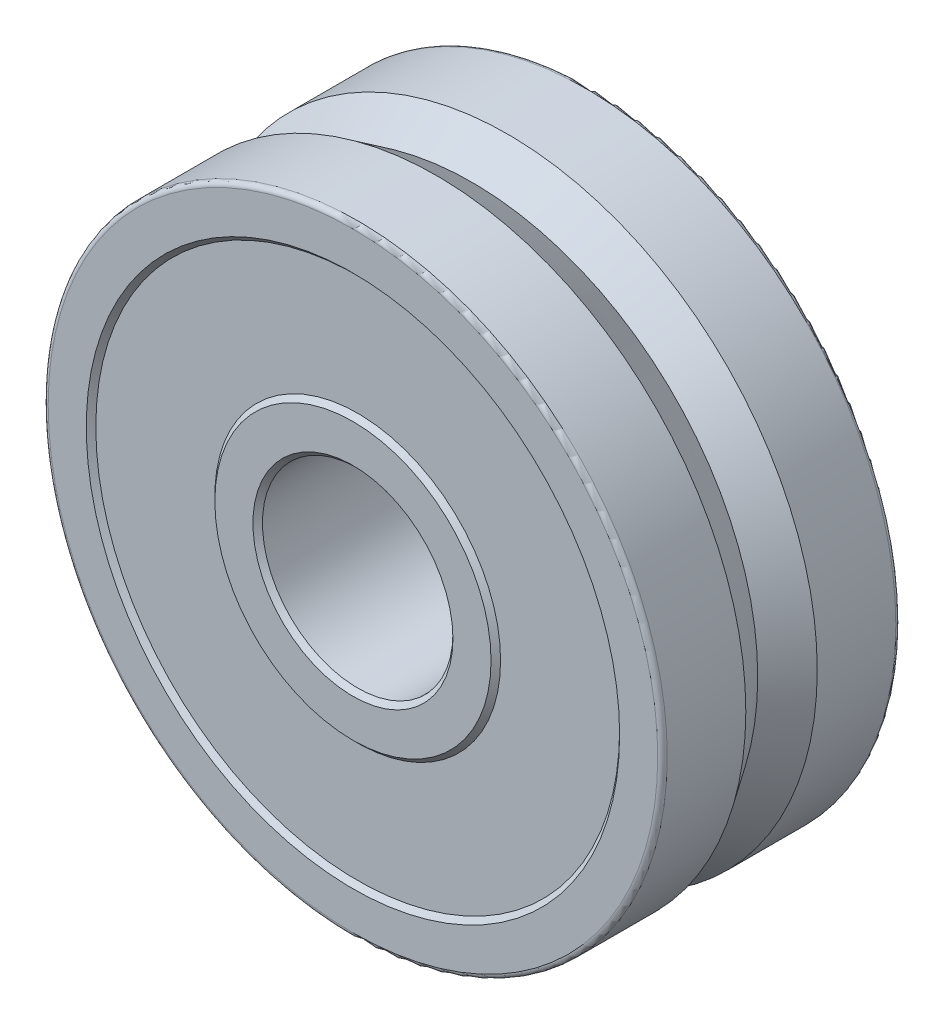
ISO-10303-21;
HEADER;
FILE_DESCRIPTION(('STEP AP214'),'2;1');
FILE_NAME('part.step','',(''),(''),'','','');
FILE_SCHEMA(('AUTOMOTIVE_DESIGN { 1 0 10303 214 1 1 1 1 }'));
ENDSEC;
DATA;
#1=APPLICATION_CONTEXT('core data for automotive mechanical design processes');
#2=APPLICATION_PROTOCOL_DEFINITION('international standard','automotive_design',2000,#1);
#3=PRODUCT_CONTEXT('',#1,'mechanical');
#4=PRODUCT('Part','Part','',(#3));
#5=PRODUCT_RELATED_PRODUCT_CATEGORY('part','',(#4));
#6=PRODUCT_DEFINITION_FORMATION('','',#4);
#7=PRODUCT_DEFINITION_CONTEXT('part definition',#1,'design');
#8=PRODUCT_DEFINITION('design','',#6,#7);
#9=PRODUCT_DEFINITION_SHAPE('','',#8);
#10=(LENGTH_UNIT() NAMED_UNIT(*) SI_UNIT(.MILLI.,.METRE.));
#11=(NAMED_UNIT(*) PLANE_ANGLE_UNIT() SI_UNIT($,.RADIAN.));
#12=(NAMED_UNIT(*) SI_UNIT($,.STERADIAN.) SOLID_ANGLE_UNIT());
#13=UNCERTAINTY_MEASURE_WITH_UNIT(LENGTH_MEASURE(1.E-05),#10,'distance_accuracy_value','');
#14=(GEOMETRIC_REPRESENTATION_CONTEXT(3) GLOBAL_UNCERTAINTY_ASSIGNED_CONTEXT((#13)) GLOBAL_UNIT_ASSIGNED_CONTEXT((#10,
#11,#12)) REPRESENTATION_CONTEXT('',''));
#15=CARTESIAN_POINT('',(0.,0.,0.));
#16=DIRECTION('',(0.,0.,1.));
#17=DIRECTION('',(1.,0.,0.));
#18=AXIS2_PLACEMENT_3D('',#15,#16,#17);
#19=CARTESIAN_POINT('',(0.,0.,2.5));
#20=DIRECTION('',(0.,0.,-1.));
#21=DIRECTION('',(-1.,0.,0.));
#22=AXIS2_PLACEMENT_3D('',#19,#20,#21);
#23=CYLINDRICAL_SURFACE('',#22,6.5);
#24=CARTESIAN_POINT('',(0.,0.,-2.4));
#25=DIRECTION('',(0.,0.,1.));
#26=DIRECTION('',(1.,0.,0.));
#27=AXIS2_PLACEMENT_3D('',#24,#25,#26);
#28=CIRCLE('',#27,6.5);
#29=CARTESIAN_POINT('',(6.5,0.,-2.4));
#30=VERTEX_POINT('',#29);
#31=EDGE_CURVE('E52',#30,#30,#28,.T.);
#32=ORIENTED_EDGE('',*,*,#31,.T.);
#33=EDGE_LOOP('',(#32));
#34=FACE_BOUND('',#33,.T.);
#35=CARTESIAN_POINT('',(0.,0.,-0.75));
#36=DIRECTION('',(0.,0.,1.));
#37=DIRECTION('',(1.,0.,0.));
#38=AXIS2_PLACEMENT_3D('',#35,#36,#37);
#39=CIRCLE('',#38,6.5);
#40=CARTESIAN_POINT('',(6.5,0.,-0.75));
#41=VERTEX_POINT('',#40);
#42=EDGE_CURVE('E75',#41,#41,#39,.T.);
#43=ORIENTED_EDGE('',*,*,#42,.F.);
#44=EDGE_LOOP('',(#43));
#45=FACE_BOUND('',#44,.T.);
#46=ADVANCED_FACE('F15',(#34,#45),#23,.T.);
#47=CARTESIAN_POINT('',(0.,0.,2.4));
#48=DIRECTION('',(0.,0.,1.));
#49=DIRECTION('',(1.,0.,0.));
#50=AXIS2_PLACEMENT_3D('',#47,#48,#49);
#51=CIRCLE('',#50,6.5);
#52=CARTESIAN_POINT('',(6.5,0.,2.4));
#53=VERTEX_POINT('',#52);
#54=EDGE_CURVE('E57',#53,#53,#51,.F.);
#55=ORIENTED_EDGE('',*,*,#54,.T.);
#56=EDGE_LOOP('',(#55));
#57=FACE_BOUND('',#56,.T.);
#58=CARTESIAN_POINT('',(0.,0.,0.75));
#59=DIRECTION('',(0.,0.,1.));
#60=DIRECTION('',(1.,0.,0.));
#61=AXIS2_PLACEMENT_3D('',#58,#59,#60);
#62=CIRCLE('',#61,6.5);
#63=CARTESIAN_POINT('',(6.5,0.,0.75));
#64=VERTEX_POINT('',#63);
#65=EDGE_CURVE('E80',#64,#64,#62,.T.);
#66=ORIENTED_EDGE('',*,*,#65,.T.);
#67=EDGE_LOOP('',(#66));
#68=FACE_BOUND('',#67,.T.);
#69=ADVANCED_FACE('F82',(#57,#68),#23,.T.);
#70=CARTESIAN_POINT('',(0.,0.,-2.5));
#71=DIRECTION('',(0.,0.,1.));
#72=DIRECTION('',(1.,0.,0.));
#73=AXIS2_PLACEMENT_3D('',#70,#71,#72);
#74=PLANE('',#73);
#75=CARTESIAN_POINT('',(0.,0.,-2.5));
#76=DIRECTION('',(0.,0.,1.));
#77=DIRECTION('',(1.,0.,0.));
#78=AXIS2_PLACEMENT_3D('',#75,#76,#77);
#79=CIRCLE('',#78,2.9);
#80=CARTESIAN_POINT('',(2.9,0.,-2.5));
#81=VERTEX_POINT('',#80);
#82=EDGE_CURVE('E22',#81,#81,#79,.F.);
#83=ORIENTED_EDGE('',*,*,#82,.T.);
#84=EDGE_LOOP('',(#83));
#85=FACE_BOUND('',#84,.T.);
#86=CARTESIAN_POINT('',(0.,0.,-2.5));
#87=DIRECTION('',(0.,0.,1.));
#88=DIRECTION('',(1.,0.,0.));
#89=AXIS2_PLACEMENT_3D('',#86,#87,#88);
#90=CIRCLE('',#89,2.1);
#91=CARTESIAN_POINT('',(2.1,0.,-2.5));
#92=VERTEX_POINT('',#91);
#93=EDGE_CURVE('E42',#92,#92,#90,.T.);
#94=ORIENTED_EDGE('',*,*,#93,.T.);
#95=EDGE_LOOP('',(#94));
#96=FACE_BOUND('',#95,.T.);
#97=ADVANCED_FACE('F105',(#85,#96),#74,.F.);
#98=CARTESIAN_POINT('',(0.,0.,2.5));
#99=DIRECTION('',(0.,0.,1.));
#100=DIRECTION('',(1.,0.,0.));
#101=AXIS2_PLACEMENT_3D('',#98,#99,#100);
#102=PLANE('',#101);
#103=CARTESIAN_POINT('',(0.,0.,2.5));
#104=DIRECTION('',(0.,0.,1.));
#105=DIRECTION('',(1.,0.,0.));
#106=AXIS2_PLACEMENT_3D('',#103,#104,#105);
#107=CIRCLE('',#106,2.9);
#108=CARTESIAN_POINT('',(2.9,0.,2.5));
#109=VERTEX_POINT('',#108);
#110=EDGE_CURVE('E27',#109,#109,#107,.T.);
#111=ORIENTED_EDGE('',*,*,#110,.T.);
#112=EDGE_LOOP('',(#111));
#113=FACE_BOUND('',#112,.T.);
#114=CARTESIAN_POINT('',(0.,0.,2.5));
#115=DIRECTION('',(0.,0.,1.));
#116=DIRECTION('',(1.,0.,0.));
#117=AXIS2_PLACEMENT_3D('',#114,#115,#116);
#118=CIRCLE('',#117,2.1);
#119=CARTESIAN_POINT('',(2.1,0.,2.5));
#120=VERTEX_POINT('',#119);
#121=EDGE_CURVE('E34',#120,#120,#118,.F.);
#122=ORIENTED_EDGE('',*,*,#121,.T.);
#123=EDGE_LOOP('',(#122));
#124=FACE_BOUND('',#123,.T.);
#125=ADVANCED_FACE('F161',(#113,#124),#102,.T.);
#126=CARTESIAN_POINT('',(0.,0.,2.5));
#127=DIRECTION('',(0.,0.,1.));
#128=DIRECTION('',(1.,0.,0.));
#129=AXIS2_PLACEMENT_3D('',#126,#127,#128);
#130=CIRCLE('',#129,5.6);
#131=CARTESIAN_POINT('',(5.6,0.,2.5));
#132=VERTEX_POINT('',#131);
#133=EDGE_CURVE('E28',#132,#132,#130,.F.);
#134=ORIENTED_EDGE('',*,*,#133,.T.);
#135=EDGE_LOOP('',(#134));
#136=FACE_BOUND('',#135,.T.);
#137=CARTESIAN_POINT('',(0.,0.,2.5));
#138=DIRECTION('',(0.,0.,1.));
#139=DIRECTION('',(1.,0.,0.));
#140=AXIS2_PLACEMENT_3D('',#137,#138,#139);
#141=CIRCLE('',#140,6.4);
#142=CARTESIAN_POINT('',(6.4,0.,2.5));
#143=VERTEX_POINT('',#142);
#144=EDGE_CURVE('E50',#143,#143,#141,.T.);
#145=ORIENTED_EDGE('',*,*,#144,.T.);
#146=EDGE_LOOP('',(#145));
#147=FACE_BOUND('',#146,.T.);
#148=ADVANCED_FACE('F157',(#136,#147),#102,.T.);
#149=CARTESIAN_POINT('',(0.,0.,-2.5));
#150=DIRECTION('',(0.,0.,1.));
#151=DIRECTION('',(1.,0.,0.));
#152=AXIS2_PLACEMENT_3D('',#149,#150,#151);
#153=CIRCLE('',#152,5.6);
#154=CARTESIAN_POINT('',(5.6,0.,-2.5));
#155=VERTEX_POINT('',#154);
#156=EDGE_CURVE('E10',#155,#155,#153,.T.);
#157=ORIENTED_EDGE('',*,*,#156,.T.);
#158=EDGE_LOOP('',(#157));
#159=FACE_BOUND('',#158,.T.);
#160=CARTESIAN_POINT('',(0.,0.,-2.5));
#161=DIRECTION('',(0.,0.,1.));
#162=DIRECTION('',(1.,0.,0.));
#163=AXIS2_PLACEMENT_3D('',#160,#161,#162);
#164=CIRCLE('',#163,6.4);
#165=CARTESIAN_POINT('',(6.4,0.,-2.5));
#166=VERTEX_POINT('',#165);
#167=EDGE_CURVE('E49',#166,#166,#164,.F.);
#168=ORIENTED_EDGE('',*,*,#167,.T.);
#169=EDGE_LOOP('',(#168));
#170=FACE_BOUND('',#169,.T.);
#171=ADVANCED_FACE('F110',(#159,#170),#74,.F.);
#172=CARTESIAN_POINT('',(0.,0.,2.5));
#173=DIRECTION('',(0.,0.,-1.));
#174=DIRECTION('',(-1.,0.,0.));
#175=AXIS2_PLACEMENT_3D('',#172,#173,#174);
#176=CYLINDRICAL_SURFACE('',#175,2.);
#177=CARTESIAN_POINT('',(0.,0.,-2.4));
#178=DIRECTION('',(0.,0.,1.));
#179=DIRECTION('',(1.,0.,0.));
#180=AXIS2_PLACEMENT_3D('',#177,#178,#179);
#181=CIRCLE('',#180,2.);
#182=CARTESIAN_POINT('',(2.,0.,-2.4));
#183=VERTEX_POINT('',#182);
#184=EDGE_CURVE('E36',#183,#183,#181,.F.);
#185=ORIENTED_EDGE('',*,*,#184,.T.);
#186=EDGE_LOOP('',(#185));
#187=FACE_BOUND('',#186,.T.);
#188=CARTESIAN_POINT('',(0.,0.,2.4));
#189=DIRECTION('',(0.,0.,1.));
#190=DIRECTION('',(1.,0.,0.));
#191=AXIS2_PLACEMENT_3D('',#188,#189,#190);
#192=CIRCLE('',#191,2.);
#193=CARTESIAN_POINT('',(2.,0.,2.4));
#194=VERTEX_POINT('',#193);
#195=EDGE_CURVE('E41',#194,#194,#192,.T.);
#196=ORIENTED_EDGE('',*,*,#195,.T.);
#197=EDGE_LOOP('',(#196));
#198=FACE_BOUND('',#197,.T.);
#199=ADVANCED_FACE('F155',(#187,#198),#176,.F.);
#200=CARTESIAN_POINT('',(0.,0.,2.4));
#201=DIRECTION('',(0.,0.,1.));
#202=DIRECTION('',(1.,0.,0.));
#203=AXIS2_PLACEMENT_3D('',#200,#201,#202);
#204=PLANE('',#203);
#205=CARTESIAN_POINT('',(0.,0.,2.4));
#206=DIRECTION('',(0.,0.,1.));
#207=DIRECTION('',(1.,0.,0.));
#208=AXIS2_PLACEMENT_3D('',#205,#206,#207);
#209=CIRCLE('',#208,3.);
#210=CARTESIAN_POINT('',(3.,0.,2.4));
#211=VERTEX_POINT('',#210);
#212=EDGE_CURVE('E62',#211,#211,#209,.T.);
#213=ORIENTED_EDGE('',*,*,#212,.F.);
#214=EDGE_LOOP('',(#213));
#215=FACE_BOUND('',#214,.T.);
#216=CARTESIAN_POINT('',(0.,0.,2.4));
#217=DIRECTION('',(0.,0.,1.));
#218=DIRECTION('',(1.,0.,0.));
#219=AXIS2_PLACEMENT_3D('',#216,#217,#218);
#220=CIRCLE('',#219,5.5);
#221=CARTESIAN_POINT('',(5.5,0.,2.4));
#222=VERTEX_POINT('',#221);
#223=EDGE_CURVE('E56',#222,#222,#220,.T.);
#224=ORIENTED_EDGE('',*,*,#223,.T.);
#225=EDGE_LOOP('',(#224));
#226=FACE_BOUND('',#225,.T.);
#227=ADVANCED_FACE('F144',(#215,#226),#204,.T.);
#228=CARTESIAN_POINT('',(0.,0.,-2.4));
#229=DIRECTION('',(0.,0.,-1.));
#230=DIRECTION('',(1.,0.,0.));
#231=AXIS2_PLACEMENT_3D('',#228,#229,#230);
#232=PLANE('',#231);
#233=CARTESIAN_POINT('',(0.,0.,-2.4));
#234=DIRECTION('',(0.,0.,1.));
#235=DIRECTION('',(1.,0.,0.));
#236=AXIS2_PLACEMENT_3D('',#233,#234,#235);
#237=CIRCLE('',#236,5.5);
#238=CARTESIAN_POINT('',(5.5,0.,-2.4));
#239=VERTEX_POINT('',#238);
#240=EDGE_CURVE('E65',#239,#239,#237,.T.);
#241=ORIENTED_EDGE('',*,*,#240,.F.);
#242=EDGE_LOOP('',(#241));
#243=FACE_BOUND('',#242,.T.);
#244=CARTESIAN_POINT('',(0.,0.,-2.4));
#245=DIRECTION('',(0.,0.,1.));
#246=DIRECTION('',(1.,0.,0.));
#247=AXIS2_PLACEMENT_3D('',#244,#245,#246);
#248=CIRCLE('',#247,3.);
#249=CARTESIAN_POINT('',(3.,0.,-2.4));
#250=VERTEX_POINT('',#249);
#251=EDGE_CURVE('E70',#250,#250,#248,.T.);
#252=ORIENTED_EDGE('',*,*,#251,.T.);
#253=EDGE_LOOP('',(#252));
#254=FACE_BOUND('',#253,.T.);
#255=ADVANCED_FACE('F114',(#243,#254),#232,.T.);
#256=CARTESIAN_POINT('',(0.,0.,-2.4));
#257=DIRECTION('',(0.,0.,1.));
#258=DIRECTION('',(1.,0.,0.));
#259=AXIS2_PLACEMENT_3D('',#256,#257,#258);
#260=TOROIDAL_SURFACE('',#259,6.4,0.1);
#261=ORIENTED_EDGE('',*,*,#167,.F.);
#262=EDGE_LOOP('',(#261));
#263=FACE_BOUND('',#262,.T.);
#264=ORIENTED_EDGE('',*,*,#31,.F.);
#265=EDGE_LOOP('',(#264));
#266=FACE_BOUND('',#265,.T.);
#267=ADVANCED_FACE('F108',(#263,#266),#260,.T.);
#268=CARTESIAN_POINT('',(0.,0.,2.4));
#269=DIRECTION('',(0.,0.,1.));
#270=DIRECTION('',(1.,0.,0.));
#271=AXIS2_PLACEMENT_3D('',#268,#269,#270);
#272=TOROIDAL_SURFACE('',#271,6.4,0.1);
#273=ORIENTED_EDGE('',*,*,#54,.F.);
#274=EDGE_LOOP('',(#273));
#275=FACE_BOUND('',#274,.T.);
#276=ORIENTED_EDGE('',*,*,#144,.F.);
#277=EDGE_LOOP('',(#276));
#278=FACE_BOUND('',#277,.T.);
#279=ADVANCED_FACE('F115',(#275,#278),#272,.T.);
#280=CARTESIAN_POINT('',(0.,0.,-2.5));
#281=DIRECTION('',(0.,0.,-1.));
#282=DIRECTION('',(-1.,0.,0.));
#283=AXIS2_PLACEMENT_3D('',#280,#281,#282);
#284=CONICAL_SURFACE('',#283,2.1,0.785398163397439);
#285=ORIENTED_EDGE('',*,*,#184,.F.);
#286=EDGE_LOOP('',(#285));
#287=FACE_BOUND('',#286,.T.);
#288=ORIENTED_EDGE('',*,*,#93,.F.);
#289=EDGE_LOOP('',(#288));
#290=FACE_BOUND('',#289,.T.);
#291=ADVANCED_FACE('F117',(#287,#290),#284,.F.);
#292=CARTESIAN_POINT('',(0.,0.,2.4));
#293=DIRECTION('',(0.,0.,1.));
#294=DIRECTION('',(1.,0.,0.));
#295=AXIS2_PLACEMENT_3D('',#292,#293,#294);
#296=CONICAL_SURFACE('',#295,2.,0.785398163397455);
#297=ORIENTED_EDGE('',*,*,#121,.F.);
#298=EDGE_LOOP('',(#297));
#299=FACE_BOUND('',#298,.T.);
#300=ORIENTED_EDGE('',*,*,#195,.F.);
#301=EDGE_LOOP('',(#300));
#302=FACE_BOUND('',#301,.T.);
#303=ADVANCED_FACE('F124',(#299,#302),#296,.F.);
#304=CARTESIAN_POINT('',(0.,0.,2.4));
#305=DIRECTION('',(0.,0.,1.));
#306=DIRECTION('',(1.,0.,0.));
#307=AXIS2_PLACEMENT_3D('',#304,#305,#306);
#308=CONICAL_SURFACE('',#307,5.5,0.785398163397448);
#309=ORIENTED_EDGE('',*,*,#133,.F.);
#310=EDGE_LOOP('',(#309));
#311=FACE_BOUND('',#310,.T.);
#312=ORIENTED_EDGE('',*,*,#223,.F.);
#313=EDGE_LOOP('',(#312));
#314=FACE_BOUND('',#313,.T.);
#315=ADVANCED_FACE('F122',(#311,#314),#308,.F.);
#316=CARTESIAN_POINT('',(0.,0.,2.5));
#317=DIRECTION('',(0.,0.,-1.));
#318=DIRECTION('',(-1.,0.,0.));
#319=AXIS2_PLACEMENT_3D('',#316,#317,#318);
#320=CONICAL_SURFACE('',#319,2.9,0.785398163397444);
#321=ORIENTED_EDGE('',*,*,#212,.T.);
#322=EDGE_LOOP('',(#321));
#323=FACE_BOUND('',#322,.T.);
#324=ORIENTED_EDGE('',*,*,#110,.F.);
#325=EDGE_LOOP('',(#324));
#326=FACE_BOUND('',#325,.T.);
#327=ADVANCED_FACE('F127',(#323,#326),#320,.T.);
#328=CARTESIAN_POINT('',(0.,0.,-2.4));
#329=DIRECTION('',(0.,0.,1.));
#330=DIRECTION('',(1.,0.,0.));
#331=AXIS2_PLACEMENT_3D('',#328,#329,#330);
#332=CONICAL_SURFACE('',#331,3.,0.785398163397444);
#333=ORIENTED_EDGE('',*,*,#82,.F.);
#334=EDGE_LOOP('',(#333));
#335=FACE_BOUND('',#334,.T.);
#336=ORIENTED_EDGE('',*,*,#251,.F.);
#337=EDGE_LOOP('',(#336));
#338=FACE_BOUND('',#337,.T.);
#339=ADVANCED_FACE('F135',(#335,#338),#332,.T.);
#340=CARTESIAN_POINT('',(0.,0.,-2.5));
#341=DIRECTION('',(0.,0.,-1.));
#342=DIRECTION('',(-1.,0.,0.));
#343=AXIS2_PLACEMENT_3D('',#340,#341,#342);
#344=CONICAL_SURFACE('',#343,5.6,0.785398163397448);
#345=ORIENTED_EDGE('',*,*,#240,.T.);
#346=EDGE_LOOP('',(#345));
#347=FACE_BOUND('',#346,.T.);
#348=ORIENTED_EDGE('',*,*,#156,.F.);
#349=EDGE_LOOP('',(#348));
#350=FACE_BOUND('',#349,.T.);
#351=ADVANCED_FACE('F17',(#347,#350),#344,.F.);
#352=CARTESIAN_POINT('',(0.,0.,0.));
#353=DIRECTION('',(0.,0.,-1.));
#354=DIRECTION('',(-1.,0.,0.));
#355=AXIS2_PLACEMENT_3D('',#352,#353,#354);
#356=CONICAL_SURFACE('',#355,6.,0.588002603547567);
#357=ORIENTED_EDGE('',*,*,#42,.T.);
#358=EDGE_LOOP('',(#357));
#359=FACE_BOUND('',#358,.T.);
#360=CARTESIAN_POINT('',(0.,0.,0.));
#361=DIRECTION('',(0.,0.,1.));
#362=DIRECTION('',(1.,0.,0.));
#363=AXIS2_PLACEMENT_3D('',#360,#361,#362);
#364=CIRCLE('',#363,6.);
#365=CARTESIAN_POINT('',(6.,0.,0.));
#366=VERTEX_POINT('',#365);
#367=EDGE_CURVE('E72',#366,#366,#364,.T.);
#368=ORIENTED_EDGE('',*,*,#367,.F.);
#369=EDGE_LOOP('',(#368));
#370=FACE_BOUND('',#369,.T.);
#371=ADVANCED_FACE('F83',(#359,#370),#356,.T.);
#372=CARTESIAN_POINT('',(0.,0.,0.75));
#373=DIRECTION('',(0.,0.,1.));
#374=DIRECTION('',(1.,0.,0.));
#375=AXIS2_PLACEMENT_3D('',#372,#373,#374);
#376=CONICAL_SURFACE('',#375,6.5,0.588002603547567);
#377=ORIENTED_EDGE('',*,*,#367,.T.);
#378=EDGE_LOOP('',(#377));
#379=FACE_BOUND('',#378,.T.);
#380=ORIENTED_EDGE('',*,*,#65,.F.);
#381=EDGE_LOOP('',(#380));
#382=FACE_BOUND('',#381,.T.);
#383=ADVANCED_FACE('F84',(#379,#382),#376,.T.);
#384=CLOSED_SHELL('',(#46,#69,#97,#125,#148,#171,#199,#227,#255,#267,#279,#291,#303,#315,#327,
#339,#351,#371,#383));
#385=MANIFOLD_SOLID_BREP('B1',#384);
#386=ADVANCED_BREP_SHAPE_REPRESENTATION('',(#18,#385),#14);
#387=SHAPE_DEFINITION_REPRESENTATION(#9,#386);
ENDSEC;
END-ISO-10303-21;
